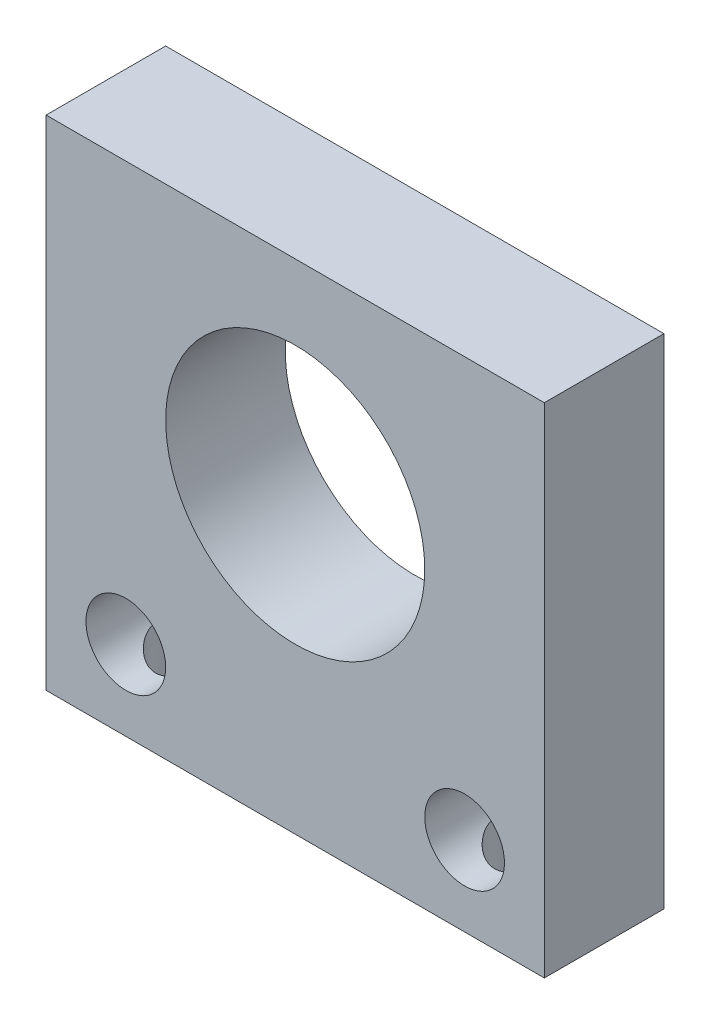
ISO-10303-21;
HEADER;
FILE_DESCRIPTION(('STEP AP214'),'2;1');
FILE_NAME('part.step','',(''),(''),'','','');
FILE_SCHEMA(('AUTOMOTIVE_DESIGN { 1 0 10303 214 1 1 1 1 }'));
ENDSEC;
DATA;
#1=APPLICATION_CONTEXT('core data for automotive mechanical design processes');
#2=APPLICATION_PROTOCOL_DEFINITION('international standard','automotive_design',2000,#1);
#3=PRODUCT_CONTEXT('',#1,'mechanical');
#4=PRODUCT('Part','Part','',(#3));
#5=PRODUCT_RELATED_PRODUCT_CATEGORY('part','',(#4));
#6=PRODUCT_DEFINITION_FORMATION('','',#4);
#7=PRODUCT_DEFINITION_CONTEXT('part definition',#1,'design');
#8=PRODUCT_DEFINITION('design','',#6,#7);
#9=PRODUCT_DEFINITION_SHAPE('','',#8);
#10=(LENGTH_UNIT() NAMED_UNIT(*) SI_UNIT(.MILLI.,.METRE.));
#11=(NAMED_UNIT(*) PLANE_ANGLE_UNIT() SI_UNIT($,.RADIAN.));
#12=(NAMED_UNIT(*) SI_UNIT($,.STERADIAN.) SOLID_ANGLE_UNIT());
#13=UNCERTAINTY_MEASURE_WITH_UNIT(LENGTH_MEASURE(1.E-05),#10,'distance_accuracy_value','');
#14=(GEOMETRIC_REPRESENTATION_CONTEXT(3) GLOBAL_UNCERTAINTY_ASSIGNED_CONTEXT((#13)) GLOBAL_UNIT_ASSIGNED_CONTEXT((#10,
#11,#12)) REPRESENTATION_CONTEXT('',''));
#15=CARTESIAN_POINT('',(0.,0.,0.));
#16=DIRECTION('',(0.,0.,1.));
#17=DIRECTION('',(1.,0.,0.));
#18=AXIS2_PLACEMENT_3D('',#15,#16,#17);
#19=CARTESIAN_POINT('',(25.,25.,12.));
#20=DIRECTION('',(-1.,0.,0.));
#21=DIRECTION('',(0.,-1.,0.));
#22=AXIS2_PLACEMENT_3D('',#19,#20,#21);
#23=PLANE('',#22);
#24=DIRECTION('',(0.,1.,0.));
#25=VECTOR('',#24,1.);
#26=CARTESIAN_POINT('',(25.,25.,0.));
#27=LINE('',#26,#25);
#28=CARTESIAN_POINT('',(25.,-25.,0.));
#29=VERTEX_POINT('',#28);
#30=CARTESIAN_POINT('',(25.,25.,0.));
#31=VERTEX_POINT('',#30);
#32=EDGE_CURVE('E95',#29,#31,#27,.T.);
#33=ORIENTED_EDGE('',*,*,#32,.T.);
#34=DIRECTION('',(0.,0.,-1.));
#35=VECTOR('',#34,1.);
#36=CARTESIAN_POINT('',(25.,25.,12.));
#37=LINE('',#36,#35);
#38=CARTESIAN_POINT('',(25.,25.,12.));
#39=VERTEX_POINT('',#38);
#40=EDGE_CURVE('E11',#39,#31,#37,.T.);
#41=ORIENTED_EDGE('',*,*,#40,.F.);
#42=DIRECTION('',(0.,1.,0.));
#43=VECTOR('',#42,1.);
#44=CARTESIAN_POINT('',(25.,25.,12.));
#45=LINE('',#44,#43);
#46=CARTESIAN_POINT('',(25.,-25.,12.));
#47=VERTEX_POINT('',#46);
#48=EDGE_CURVE('E83',#47,#39,#45,.T.);
#49=ORIENTED_EDGE('',*,*,#48,.F.);
#50=DIRECTION('',(0.,0.,-1.));
#51=VECTOR('',#50,1.);
#52=CARTESIAN_POINT('',(25.,-25.,12.));
#53=LINE('',#52,#51);
#54=EDGE_CURVE('E91',#47,#29,#53,.T.);
#55=ORIENTED_EDGE('',*,*,#54,.T.);
#56=EDGE_LOOP('',(#33,#41,#49,#55));
#57=FACE_BOUND('',#56,.T.);
#58=ADVANCED_FACE('F32',(#57),#23,.F.);
#59=CARTESIAN_POINT('',(-25.,25.,12.));
#60=DIRECTION('',(0.,-1.,0.));
#61=DIRECTION('',(0.,0.,-1.));
#62=AXIS2_PLACEMENT_3D('',#59,#60,#61);
#63=PLANE('',#62);
#64=DIRECTION('',(-1.,0.,0.));
#65=VECTOR('',#64,1.);
#66=CARTESIAN_POINT('',(-25.,25.,0.));
#67=LINE('',#66,#65);
#68=CARTESIAN_POINT('',(-25.,25.,0.));
#69=VERTEX_POINT('',#68);
#70=EDGE_CURVE('E87',#31,#69,#67,.T.);
#71=ORIENTED_EDGE('',*,*,#70,.T.);
#72=DIRECTION('',(0.,0.,-1.));
#73=VECTOR('',#72,1.);
#74=CARTESIAN_POINT('',(-25.,25.,12.));
#75=LINE('',#74,#73);
#76=CARTESIAN_POINT('',(-25.,25.,12.));
#77=VERTEX_POINT('',#76);
#78=EDGE_CURVE('E40',#77,#69,#75,.T.);
#79=ORIENTED_EDGE('',*,*,#78,.F.);
#80=DIRECTION('',(-1.,0.,0.));
#81=VECTOR('',#80,1.);
#82=CARTESIAN_POINT('',(-25.,25.,12.));
#83=LINE('',#82,#81);
#84=EDGE_CURVE('E78',#39,#77,#83,.T.);
#85=ORIENTED_EDGE('',*,*,#84,.F.);
#86=ORIENTED_EDGE('',*,*,#40,.T.);
#87=EDGE_LOOP('',(#71,#79,#85,#86));
#88=FACE_BOUND('',#87,.T.);
#89=ADVANCED_FACE('F86',(#88),#63,.F.);
#90=CARTESIAN_POINT('',(-25.,25.,12.));
#91=DIRECTION('',(1.,0.,0.));
#92=DIRECTION('',(0.,1.,0.));
#93=AXIS2_PLACEMENT_3D('',#90,#91,#92);
#94=PLANE('',#93);
#95=DIRECTION('',(0.,-1.,0.));
#96=VECTOR('',#95,1.);
#97=CARTESIAN_POINT('',(-25.,25.,0.));
#98=LINE('',#97,#96);
#99=CARTESIAN_POINT('',(-25.,-25.,0.));
#100=VERTEX_POINT('',#99);
#101=EDGE_CURVE('E65',#69,#100,#98,.T.);
#102=ORIENTED_EDGE('',*,*,#101,.T.);
#103=DIRECTION('',(0.,0.,-1.));
#104=VECTOR('',#103,1.);
#105=CARTESIAN_POINT('',(-25.,-25.,12.));
#106=LINE('',#105,#104);
#107=CARTESIAN_POINT('',(-25.,-25.,12.));
#108=VERTEX_POINT('',#107);
#109=EDGE_CURVE('E88',#108,#100,#106,.T.);
#110=ORIENTED_EDGE('',*,*,#109,.F.);
#111=DIRECTION('',(0.,-1.,0.));
#112=VECTOR('',#111,1.);
#113=CARTESIAN_POINT('',(-25.,25.,12.));
#114=LINE('',#113,#112);
#115=EDGE_CURVE('E81',#77,#108,#114,.T.);
#116=ORIENTED_EDGE('',*,*,#115,.F.);
#117=ORIENTED_EDGE('',*,*,#78,.T.);
#118=EDGE_LOOP('',(#102,#110,#116,#117));
#119=FACE_BOUND('',#118,.T.);
#120=ADVANCED_FACE('F89',(#119),#94,.F.);
#121=CARTESIAN_POINT('',(-25.,-25.,12.));
#122=DIRECTION('',(0.,1.,0.));
#123=DIRECTION('',(0.,0.,1.));
#124=AXIS2_PLACEMENT_3D('',#121,#122,#123);
#125=PLANE('',#124);
#126=CARTESIAN_POINT('',(-17.,-25.,6.));
#127=DIRECTION('',(0.,-1.,0.));
#128=DIRECTION('',(0.,0.,-1.));
#129=AXIS2_PLACEMENT_3D('',#126,#127,#128);
#130=CIRCLE('',#129,3.);
#131=CARTESIAN_POINT('',(-17.,-25.,3.));
#132=VERTEX_POINT('',#131);
#133=EDGE_CURVE('E136',#132,#132,#130,.T.);
#134=ORIENTED_EDGE('',*,*,#133,.F.);
#135=EDGE_LOOP('',(#134));
#136=FACE_BOUND('',#135,.T.);
#137=CARTESIAN_POINT('',(17.,-25.,6.));
#138=DIRECTION('',(0.,-1.,0.));
#139=DIRECTION('',(0.,0.,-1.));
#140=AXIS2_PLACEMENT_3D('',#137,#138,#139);
#141=CIRCLE('',#140,2.99999999999999);
#142=CARTESIAN_POINT('',(17.,-25.,3.00000000000001));
#143=VERTEX_POINT('',#142);
#144=EDGE_CURVE('E126',#143,#143,#141,.T.);
#145=ORIENTED_EDGE('',*,*,#144,.F.);
#146=EDGE_LOOP('',(#145));
#147=FACE_BOUND('',#146,.T.);
#148=DIRECTION('',(1.,0.,0.));
#149=VECTOR('',#148,1.);
#150=CARTESIAN_POINT('',(-25.,-25.,0.));
#151=LINE('',#150,#149);
#152=EDGE_CURVE('E71',#100,#29,#151,.T.);
#153=ORIENTED_EDGE('',*,*,#152,.T.);
#154=ORIENTED_EDGE('',*,*,#54,.F.);
#155=DIRECTION('',(1.,0.,0.));
#156=VECTOR('',#155,1.);
#157=CARTESIAN_POINT('',(-25.,-25.,12.));
#158=LINE('',#157,#156);
#159=EDGE_CURVE('E48',#108,#47,#158,.T.);
#160=ORIENTED_EDGE('',*,*,#159,.F.);
#161=ORIENTED_EDGE('',*,*,#109,.T.);
#162=EDGE_LOOP('',(#153,#154,#160,#161));
#163=FACE_BOUND('',#162,.T.);
#164=ADVANCED_FACE('F103',(#136,#147,#163),#125,.F.);
#165=CARTESIAN_POINT('',(25.,-25.,12.));
#166=DIRECTION('',(0.,0.,1.));
#167=DIRECTION('',(1.,0.,0.));
#168=AXIS2_PLACEMENT_3D('',#165,#166,#167);
#169=PLANE('',#168);
#170=CARTESIAN_POINT('',(17.,-17.,12.));
#171=DIRECTION('',(0.,0.,1.));
#172=DIRECTION('',(1.,0.,0.));
#173=AXIS2_PLACEMENT_3D('',#170,#171,#172);
#174=CIRCLE('',#173,4.);
#175=CARTESIAN_POINT('',(21.,-17.,12.));
#176=VERTEX_POINT('',#175);
#177=EDGE_CURVE('E123',#176,#176,#174,.T.);
#178=ORIENTED_EDGE('',*,*,#177,.F.);
#179=EDGE_LOOP('',(#178));
#180=FACE_BOUND('',#179,.T.);
#181=CARTESIAN_POINT('',(-17.,-17.,12.));
#182=DIRECTION('',(0.,0.,1.));
#183=DIRECTION('',(1.,0.,0.));
#184=AXIS2_PLACEMENT_3D('',#181,#182,#183);
#185=CIRCLE('',#184,4.);
#186=CARTESIAN_POINT('',(-13.,-17.,12.));
#187=VERTEX_POINT('',#186);
#188=EDGE_CURVE('E117',#187,#187,#185,.T.);
#189=ORIENTED_EDGE('',*,*,#188,.F.);
#190=EDGE_LOOP('',(#189));
#191=FACE_BOUND('',#190,.T.);
#192=CARTESIAN_POINT('',(0.,4.5,12.));
#193=DIRECTION('',(0.,0.,1.));
#194=DIRECTION('',(1.,0.,0.));
#195=AXIS2_PLACEMENT_3D('',#192,#193,#194);
#196=CIRCLE('',#195,13.);
#197=CARTESIAN_POINT('',(13.,4.5,12.));
#198=VERTEX_POINT('',#197);
#199=EDGE_CURVE('E111',#198,#198,#196,.T.);
#200=ORIENTED_EDGE('',*,*,#199,.F.);
#201=EDGE_LOOP('',(#200));
#202=FACE_BOUND('',#201,.T.);
#203=ORIENTED_EDGE('',*,*,#48,.T.);
#204=ORIENTED_EDGE('',*,*,#84,.T.);
#205=ORIENTED_EDGE('',*,*,#115,.T.);
#206=ORIENTED_EDGE('',*,*,#159,.T.);
#207=EDGE_LOOP('',(#203,#204,#205,#206));
#208=FACE_BOUND('',#207,.T.);
#209=ADVANCED_FACE('F79',(#180,#191,#202,#208),#169,.T.);
#210=CARTESIAN_POINT('',(25.,-25.,0.));
#211=DIRECTION('',(0.,0.,1.));
#212=DIRECTION('',(1.,0.,0.));
#213=AXIS2_PLACEMENT_3D('',#210,#211,#212);
#214=PLANE('',#213);
#215=CARTESIAN_POINT('',(17.,-17.,0.));
#216=DIRECTION('',(0.,0.,1.));
#217=DIRECTION('',(1.,0.,0.));
#218=AXIS2_PLACEMENT_3D('',#215,#216,#217);
#219=CIRCLE('',#218,4.);
#220=CARTESIAN_POINT('',(21.,-17.,0.));
#221=VERTEX_POINT('',#220);
#222=EDGE_CURVE('E120',#221,#221,#219,.F.);
#223=ORIENTED_EDGE('',*,*,#222,.F.);
#224=EDGE_LOOP('',(#223));
#225=FACE_BOUND('',#224,.T.);
#226=CARTESIAN_POINT('',(-17.,-17.,0.));
#227=DIRECTION('',(0.,0.,1.));
#228=DIRECTION('',(1.,0.,0.));
#229=AXIS2_PLACEMENT_3D('',#226,#227,#228);
#230=CIRCLE('',#229,4.);
#231=CARTESIAN_POINT('',(-13.,-17.,0.));
#232=VERTEX_POINT('',#231);
#233=EDGE_CURVE('E114',#232,#232,#230,.F.);
#234=ORIENTED_EDGE('',*,*,#233,.F.);
#235=EDGE_LOOP('',(#234));
#236=FACE_BOUND('',#235,.T.);
#237=CARTESIAN_POINT('',(0.,4.5,0.));
#238=DIRECTION('',(0.,0.,1.));
#239=DIRECTION('',(1.,0.,0.));
#240=AXIS2_PLACEMENT_3D('',#237,#238,#239);
#241=CIRCLE('',#240,13.);
#242=CARTESIAN_POINT('',(13.,4.5,0.));
#243=VERTEX_POINT('',#242);
#244=EDGE_CURVE('E98',#243,#243,#241,.F.);
#245=ORIENTED_EDGE('',*,*,#244,.F.);
#246=EDGE_LOOP('',(#245));
#247=FACE_BOUND('',#246,.T.);
#248=ORIENTED_EDGE('',*,*,#32,.F.);
#249=ORIENTED_EDGE('',*,*,#152,.F.);
#250=ORIENTED_EDGE('',*,*,#101,.F.);
#251=ORIENTED_EDGE('',*,*,#70,.F.);
#252=EDGE_LOOP('',(#248,#249,#250,#251));
#253=FACE_BOUND('',#252,.T.);
#254=ADVANCED_FACE('F106',(#225,#236,#247,#253),#214,.F.);
#255=CARTESIAN_POINT('',(0.,4.5,-0.000999999999999265));
#256=DIRECTION('',(0.,0.,1.));
#257=DIRECTION('',(1.,0.,0.));
#258=AXIS2_PLACEMENT_3D('',#255,#256,#257);
#259=CYLINDRICAL_SURFACE('',#258,13.);
#260=ORIENTED_EDGE('',*,*,#199,.T.);
#261=EDGE_LOOP('',(#260));
#262=FACE_BOUND('',#261,.T.);
#263=ORIENTED_EDGE('',*,*,#244,.T.);
#264=EDGE_LOOP('',(#263));
#265=FACE_BOUND('',#264,.T.);
#266=ADVANCED_FACE('F177',(#262,#265),#259,.F.);
#267=CARTESIAN_POINT('',(-17.,-17.,-0.000999999999999265));
#268=DIRECTION('',(0.,0.,1.));
#269=DIRECTION('',(1.,0.,0.));
#270=AXIS2_PLACEMENT_3D('',#267,#268,#269);
#271=CYLINDRICAL_SURFACE('',#270,4.);
#272=CARTESIAN_POINT('',(-17.,-21.,3.));
#273=CARTESIAN_POINT('',(-17.073261367768,-20.9999992990119,3.00000074201897));
#274=CARTESIAN_POINT('',(-17.1465423510536,-20.9979806034464,3.00269050698686));
#275=CARTESIAN_POINT('',(-17.2925085389935,-20.9899624569939,3.013394860135));
#276=CARTESIAN_POINT('',(-17.3651933607932,-20.9839606241637,3.0214126345048));
#277=CARTESIAN_POINT('',(-17.5817314069839,-20.9601274508711,3.05333590602824));
#278=CARTESIAN_POINT('',(-17.7238926603924,-20.9364688801344,3.08511095799108));
#279=CARTESIAN_POINT('',(-17.9985066390113,-20.8759149040789,3.16742520757524));
#280=CARTESIAN_POINT('',(-18.1310126346565,-20.8391000031407,3.21785034838289));
#281=CARTESIAN_POINT('',(-18.3848352699409,-20.7550101702153,3.33508536693153));
#282=CARTESIAN_POINT('',(-18.5061551685841,-20.7077382985354,3.40189045158351));
#283=CARTESIAN_POINT('',(-18.7469321319516,-20.6009935701353,3.55652372522062));
#284=CARTESIAN_POINT('',(-18.8651763103052,-20.5407962331428,3.64572585127334));
#285=CARTESIAN_POINT('',(-19.0860644994078,-20.4153302798122,3.83900049584301));
#286=CARTESIAN_POINT('',(-19.1886839109146,-20.3500539063521,3.94309597244776));
#287=CARTESIAN_POINT('',(-19.3399322802619,-20.2449223726166,4.12053534410459));
#288=CARTESIAN_POINT('',(-19.3937945830414,-20.2052891581058,4.18963011240945));
#289=CARTESIAN_POINT('',(-19.4954835854826,-20.1267688793375,4.33258913082427));
#290=CARTESIAN_POINT('',(-19.5433084651355,-20.0878820430606,4.40645480905105));
#291=CARTESIAN_POINT('',(-19.6326117861933,-20.0121056255303,4.55877179488022));
#292=CARTESIAN_POINT('',(-19.6740978469184,-19.9752136814322,4.6372174379625));
#293=CARTESIAN_POINT('',(-19.7504313267714,-19.9047933973139,4.79870704754895));
#294=CARTESIAN_POINT('',(-19.785279820775,-19.8712645131028,4.88175026671391));
#295=CARTESIAN_POINT('',(-19.8576009065895,-19.7995453278082,5.07896227542374));
#296=CARTESIAN_POINT('',(-19.8925103700841,-19.7631556192376,5.19476977393461));
#297=CARTESIAN_POINT('',(-19.9484165631614,-19.7034312888821,5.43279706313414));
#298=CARTESIAN_POINT('',(-19.969445144175,-19.6800667983994,5.55500147433672));
#299=CARTESIAN_POINT('',(-19.996255598243,-19.6500753549433,5.80436202447177));
#300=CARTESIAN_POINT('',(-20.0018988715729,-19.6436005765876,5.93155277328338));
#301=CARTESIAN_POINT('',(-19.9969644904294,-19.6491905924503,6.18523066222906));
#302=CARTESIAN_POINT('',(-19.9863810204854,-19.6612620334149,6.31171753379498));
#303=CARTESIAN_POINT('',(-19.9519547346266,-19.6993524750279,6.54638250405958));
#304=CARTESIAN_POINT('',(-19.9296497136706,-19.7237431438601,6.65507269013584));
#305=CARTESIAN_POINT('',(-19.8741134363738,-19.7822838542336,6.86687780944832));
#306=CARTESIAN_POINT('',(-19.8408716781774,-19.8164432719457,6.96998727261395));
#307=CARTESIAN_POINT('',(-19.7406612760479,-19.9148353872999,7.23251274568741));
#308=CARTESIAN_POINT('',(-19.6656029678939,-19.9845129831659,7.38680082588364));
#309=CARTESIAN_POINT('',(-19.4923604682809,-20.1306659625217,7.67839305515968));
#310=CARTESIAN_POINT('',(-19.3941200856505,-20.2071575776123,7.81565468051557));
#311=CARTESIAN_POINT('',(-19.1730320814964,-20.3610334463755,8.07550677875058));
#312=CARTESIAN_POINT('',(-19.0496275103998,-20.4383917346593,8.19764121323223));
#313=CARTESIAN_POINT('',(-18.7808450435398,-20.5849607595651,8.42052729409203));
#314=CARTESIAN_POINT('',(-18.6355101085255,-20.65418696517,8.52131984052875));
#315=CARTESIAN_POINT('',(-18.3558041609579,-20.765594521557,8.6799615984263));
#316=CARTESIAN_POINT('',(-18.2250797406269,-20.810415419168,8.74236918857447));
#317=CARTESIAN_POINT('',(-17.9527043461487,-20.8874580880713,8.84844976078491));
#318=CARTESIAN_POINT('',(-17.8110602811554,-20.9196877491006,8.89213447637317));
#319=CARTESIAN_POINT('',(-17.5193524659451,-20.9689117737123,8.95850672640209));
#320=CARTESIAN_POINT('',(-17.3692425664775,-20.9858118631461,8.98106436025722));
#321=CARTESIAN_POINT('',(-17.0664024759298,-21.0023176694794,9.00309919236444));
#322=CARTESIAN_POINT('',(-16.9136734175787,-21.0019306830649,9.00258612850555));
#323=CARTESIAN_POINT('',(-16.6263915776414,-20.9848509559687,8.97977826944533));
#324=CARTESIAN_POINT('',(-16.4915553886724,-20.9698017763078,8.9596789546577));
#325=CARTESIAN_POINT('',(-16.2277786150078,-20.9270263597225,8.90205241154316));
#326=CARTESIAN_POINT('',(-16.0988392912168,-20.8992974253459,8.86452147483979));
#327=CARTESIAN_POINT('',(-15.8451666091751,-20.8319967842818,8.77222504832848));
#328=CARTESIAN_POINT('',(-15.7207422941255,-20.7920416528168,8.71689805245005));
#329=CARTESIAN_POINT('',(-15.4829623066276,-20.7033390611367,8.59165467378648));
#330=CARTESIAN_POINT('',(-15.3696081686064,-20.6545903847149,8.52173627270121));
#331=CARTESIAN_POINT('',(-15.136979535,-20.5423857594511,8.356435318386));
#332=CARTESIAN_POINT('',(-15.0198776855908,-20.47783324856,8.25875020522044));
#333=CARTESIAN_POINT('',(-14.8025492667112,-20.3447676839449,8.04797519436536));
#334=CARTESIAN_POINT('',(-14.7023611956172,-20.2762460592597,7.93485118533679));
#335=CARTESIAN_POINT('',(-14.5567623903738,-20.1678364186478,7.74317016965753));
#336=CARTESIAN_POINT('',(-14.5055879215901,-20.1275785522415,7.6691421417943));
#337=CARTESIAN_POINT('',(-14.4097522381844,-20.0486852312407,7.51617327787244));
#338=CARTESIAN_POINT('',(-14.3650934165984,-20.0100503764292,7.43723065191454));
#339=CARTESIAN_POINT('',(-14.2415900715641,-19.8988473562949,7.19341713181211));
#340=CARTESIAN_POINT('',(-14.1727713344538,-19.8306293449371,7.02097812384012));
#341=CARTESIAN_POINT('',(-14.0876783816709,-19.7423730621723,6.72915376575461));
#342=CARTESIAN_POINT('',(-14.0613779330393,-19.7139150253515,6.61521315950869));
#343=CARTESIAN_POINT('',(-14.0221714288551,-19.6708423304846,6.3825904834344));
#344=CARTESIAN_POINT('',(-14.0092354754516,-19.6561967788127,6.2639196166269));
#345=CARTESIAN_POINT('',(-13.9976930134541,-19.6431516796451,6.02434080493913));
#346=CARTESIAN_POINT('',(-13.9991592496169,-19.6448346059719,5.90342458554553));
#347=CARTESIAN_POINT('',(-14.0164627676864,-19.6643291788691,5.66388585032168));
#348=CARTESIAN_POINT('',(-14.0323185945897,-19.6821616385503,5.54526649617948));
#349=CARTESIAN_POINT('',(-14.0821217076285,-19.7363463967713,5.28817442441489));
#350=CARTESIAN_POINT('',(-14.1192628409931,-19.7758918581173,5.15102076535943));
#351=CARTESIAN_POINT('',(-14.2106132693348,-19.8676615343469,4.88691513829302));
#352=CARTESIAN_POINT('',(-14.2648656788297,-19.9199176988772,4.75998996808799));
#353=CARTESIAN_POINT('',(-14.3683867754536,-20.0129344017458,4.5567275201652));
#354=CARTESIAN_POINT('',(-14.4135168318761,-20.0518907245486,4.47738514370472));
#355=CARTESIAN_POINT('',(-14.5103774221758,-20.1314053591909,4.32368527646728));
#356=CARTESIAN_POINT('',(-14.562107603781,-20.1719635854515,4.24932751996646));
#357=CARTESIAN_POINT('',(-14.6719957002683,-20.2534724847945,4.10564453928959));
#358=CARTESIAN_POINT('',(-14.7301590471855,-20.2944234624514,4.03632365123923));
#359=CARTESIAN_POINT('',(-14.8527441978248,-20.3756032435117,3.90297982513369));
#360=CARTESIAN_POINT('',(-14.9171663099554,-20.4158320112115,3.83895714844265));
#361=CARTESIAN_POINT('',(-15.052718097185,-20.4948965138371,3.71602666692274));
#362=CARTESIAN_POINT('',(-15.1239000908959,-20.5337175166899,3.65716691863947));
#363=CARTESIAN_POINT('',(-15.2723201291205,-20.6086050255633,3.54567024293731));
#364=CARTESIAN_POINT('',(-15.3495568956644,-20.644672109693,3.49303200820526));
#365=CARTESIAN_POINT('',(-15.5096968258951,-20.7130254144582,3.39465805794524));
#366=CARTESIAN_POINT('',(-15.5925898186047,-20.74531815238,3.34891040356802));
#367=CARTESIAN_POINT('',(-15.7636575645171,-20.8052164046783,3.26494328395666));
#368=CARTESIAN_POINT('',(-15.8518295610309,-20.8328243370667,3.22671993349348));
#369=CARTESIAN_POINT('',(-16.0702608597425,-20.8927029417692,3.14443730103296));
#370=CARTESIAN_POINT('',(-16.202876968798,-20.9221986286542,3.10447563718239));
#371=CARTESIAN_POINT('',(-16.4743325364694,-20.967682598769,3.04315512041072));
#372=CARTESIAN_POINT('',(-16.6131534618698,-20.9837086019408,3.02174431321158));
#373=CARTESIAN_POINT('',(-16.7940719994169,-20.994909382017,3.00679070137652));
#374=CARTESIAN_POINT('',(-16.8351838911798,-20.9968157643703,3.00424689717904));
#375=CARTESIAN_POINT('',(-16.9175284379407,-20.9993613726478,3.00085120146832));
#376=CARTESIAN_POINT('',(-16.9587611113093,-21.0000003945868,2.99999958231686));
#377=CARTESIAN_POINT('',(-17.,-21.,3.));
#378=B_SPLINE_CURVE_WITH_KNOTS('',3,(#272,#273,#274,#275,#276,#277,#278,#279,#280,#281,#282,
#283,#284,#285,#286,#287,#288,#289,#290,#291,#292,#293,#294,#295,#296,#297,#298,#299,#300,#301,
#302,#303,#304,#305,#306,#307,#308,#309,#310,#311,#312,#313,#314,#315,#316,#317,#318,#319,#320,
#321,#322,#323,#324,#325,#326,#327,#328,#329,#330,#331,#332,#333,#334,#335,#336,#337,#338,#339,
#340,#341,#342,#343,#344,#345,#346,#347,#348,#349,#350,#351,#352,#353,#354,#355,#356,#357,#358,
#359,#360,#361,#362,#363,#364,#365,#366,#367,#368,#369,#370,#371,#372,#373,#374,#375,#376,#377),
.UNSPECIFIED.,.T.,.F.,(4,2,2,2,2,2,2,2,2,2,2,2,2,2,2,2,2,2,2,2,2,2,2,2,2,2,2,2,2,2,2,2,2,2,2,2,
2,2,2,2,2,2,2,2,2,2,2,2,2,2,2,2,4),(0.,0.219733524191398,0.439598569068991,0.879847634771394,
1.31744766307167,1.75491979362349,2.2329036222735,2.71163236402815,2.99983518527188,
3.28812468015056,3.57606487508902,3.86395840178996,4.24151729125786,4.61820678456563,
4.99827867308497,5.37848680666403,5.71806472391401,6.05796967267263,6.61051355677803,
7.16441076781762,7.73224459942165,8.29898017053365,8.75205702078762,9.20484951352218,
9.6604080839978,10.1157743699921,10.5253506608997,10.9350141243761,11.3591357103334,
11.7833160002107,12.2783345622972,12.7744651003689,13.0698938265096,13.3654307846348,
13.9540907813181,14.3138420927746,14.6727868466003,15.033545541411,15.3947698355934,
15.8348522835191,16.2760525671149,16.5734564783342,16.8708445226935,17.1684856206864,
17.466141392762,17.7663250552984,18.0664455283282,18.3660398682404,18.6654791022959,
19.0884486476652,19.5102297424977,19.6338980344064,19.7575862294511),.UNSPECIFIED.);
#379=CARTESIAN_POINT('',(-17.,-21.,3.));
#380=VERTEX_POINT('',#379);
#381=EDGE_CURVE('E149',#380,#380,#378,.T.);
#382=ORIENTED_EDGE('',*,*,#381,.F.);
#383=EDGE_LOOP('',(#382));
#384=FACE_BOUND('',#383,.T.);
#385=ORIENTED_EDGE('',*,*,#188,.T.);
#386=EDGE_LOOP('',(#385));
#387=FACE_BOUND('',#386,.T.);
#388=ORIENTED_EDGE('',*,*,#233,.T.);
#389=EDGE_LOOP('',(#388));
#390=FACE_BOUND('',#389,.T.);
#391=ADVANCED_FACE('F170',(#384,#387,#390),#271,.F.);
#392=CARTESIAN_POINT('',(17.,-17.,-0.000999999999999265));
#393=DIRECTION('',(0.,0.,1.));
#394=DIRECTION('',(1.,0.,0.));
#395=AXIS2_PLACEMENT_3D('',#392,#393,#394);
#396=CYLINDRICAL_SURFACE('',#395,4.);
#397=CARTESIAN_POINT('',(17.,-21.,3.00000000000001));
#398=CARTESIAN_POINT('',(16.926738632232,-20.9999992990119,3.00000074201898));
#399=CARTESIAN_POINT('',(16.8534576489464,-20.9979806034464,3.00269050698687));
#400=CARTESIAN_POINT('',(16.7074914610065,-20.9899624569939,3.01339486013501));
#401=CARTESIAN_POINT('',(16.6348066392068,-20.9839606241637,3.02141263450481));
#402=CARTESIAN_POINT('',(16.4182685930161,-20.9601274508711,3.05333590602825));
#403=CARTESIAN_POINT('',(16.2761073396076,-20.9364688801344,3.08511095799109));
#404=CARTESIAN_POINT('',(16.0014933609887,-20.8759149040789,3.16742520757525));
#405=CARTESIAN_POINT('',(15.8689873653435,-20.8391000031407,3.2178503483829));
#406=CARTESIAN_POINT('',(15.6151647300591,-20.7550101702152,3.33508536693154));
#407=CARTESIAN_POINT('',(15.4938448314159,-20.7077382985354,3.40189045158352));
#408=CARTESIAN_POINT('',(15.2530678680484,-20.6009935701353,3.55652372522063));
#409=CARTESIAN_POINT('',(15.1348236896948,-20.5407962331428,3.64572585127335));
#410=CARTESIAN_POINT('',(14.9139355005922,-20.4153302798122,3.83900049584302));
#411=CARTESIAN_POINT('',(14.8113160890854,-20.3500539063521,3.94309597244776));
#412=CARTESIAN_POINT('',(14.6600677197381,-20.2449223726166,4.12053534410459));
#413=CARTESIAN_POINT('',(14.6062054169586,-20.2052891581058,4.18963011240946));
#414=CARTESIAN_POINT('',(14.5045164145175,-20.1267688793375,4.33258913082428));
#415=CARTESIAN_POINT('',(14.4566915348645,-20.0878820430606,4.40645480905105));
#416=CARTESIAN_POINT('',(14.3673882138067,-20.0121056255303,4.55877179488023));
#417=CARTESIAN_POINT('',(14.3259021530816,-19.9752136814322,4.63721743796251));
#418=CARTESIAN_POINT('',(14.2495686732286,-19.9047933973139,4.79870704754896));
#419=CARTESIAN_POINT('',(14.214720179225,-19.8712645131028,4.88175026671392));
#420=CARTESIAN_POINT('',(14.1423990934105,-19.7995453278082,5.07896227542375));
#421=CARTESIAN_POINT('',(14.1074896299159,-19.7631556192376,5.19476977393461));
#422=CARTESIAN_POINT('',(14.0515834368386,-19.7034312888821,5.43279706313415));
#423=CARTESIAN_POINT('',(14.030554855825,-19.6800667983994,5.55500147433672));
#424=CARTESIAN_POINT('',(14.003744401757,-19.6500753549433,5.80436202447177));
#425=CARTESIAN_POINT('',(13.9981011284271,-19.6436005765876,5.93155277328338));
#426=CARTESIAN_POINT('',(14.0030355095706,-19.6491905924503,6.18523066222906));
#427=CARTESIAN_POINT('',(14.0136189795146,-19.6612620334149,6.31171753379498));
#428=CARTESIAN_POINT('',(14.0480452653734,-19.6993524750279,6.54638250405958));
#429=CARTESIAN_POINT('',(14.0703502863294,-19.7237431438601,6.65507269013584));
#430=CARTESIAN_POINT('',(14.1258865636262,-19.7822838542336,6.86687780944832));
#431=CARTESIAN_POINT('',(14.1591283218226,-19.8164432719457,6.96998727261396));
#432=CARTESIAN_POINT('',(14.2593387239521,-19.9148353872999,7.23251274568741));
#433=CARTESIAN_POINT('',(14.3343970321061,-19.9845129831659,7.38680082588364));
#434=CARTESIAN_POINT('',(14.5076395317191,-20.1306659625217,7.67839305515968));
#435=CARTESIAN_POINT('',(14.6058799143495,-20.2071575776123,7.81565468051557));
#436=CARTESIAN_POINT('',(14.8269679185037,-20.3610334463755,8.07550677875058));
#437=CARTESIAN_POINT('',(14.9503724896002,-20.4383917346593,8.19764121323223));
#438=CARTESIAN_POINT('',(15.2191549564602,-20.5849607595651,8.42052729409203));
#439=CARTESIAN_POINT('',(15.3644898914746,-20.65418696517,8.52131984052875));
#440=CARTESIAN_POINT('',(15.6441958390421,-20.765594521557,8.6799615984263));
#441=CARTESIAN_POINT('',(15.7749202593731,-20.810415419168,8.74236918857447));
#442=CARTESIAN_POINT('',(16.0472956538513,-20.8874580880713,8.84844976078491));
#443=CARTESIAN_POINT('',(16.1889397188446,-20.9196877491006,8.89213447637317));
#444=CARTESIAN_POINT('',(16.4806475340549,-20.9689117737123,8.95850672640209));
#445=CARTESIAN_POINT('',(16.6307574335225,-20.9858118631461,8.98106436025722));
#446=CARTESIAN_POINT('',(16.9335975240702,-21.0023176694794,9.00309919236444));
#447=CARTESIAN_POINT('',(17.0863265824213,-21.0019306830649,9.00258612850555));
#448=CARTESIAN_POINT('',(17.3736084223586,-20.9848509559687,8.97977826944533));
#449=CARTESIAN_POINT('',(17.5084446113276,-20.9698017763078,8.9596789546577));
#450=CARTESIAN_POINT('',(17.7722213849922,-20.9270263597225,8.90205241154316));
#451=CARTESIAN_POINT('',(17.9011607087832,-20.8992974253459,8.86452147483979));
#452=CARTESIAN_POINT('',(18.1548333908249,-20.8319967842818,8.77222504832848));
#453=CARTESIAN_POINT('',(18.2792577058745,-20.7920416528168,8.71689805245005));
#454=CARTESIAN_POINT('',(18.5170376933724,-20.7033390611367,8.59165467378648));
#455=CARTESIAN_POINT('',(18.6303918313936,-20.6545903847149,8.52173627270121));
#456=CARTESIAN_POINT('',(18.863020465,-20.5423857594511,8.356435318386));
#457=CARTESIAN_POINT('',(18.9801223144092,-20.47783324856,8.25875020522044));
#458=CARTESIAN_POINT('',(19.1974507332888,-20.3447676839449,8.04797519436536));
#459=CARTESIAN_POINT('',(19.2976388043828,-20.2762460592597,7.93485118533679));
#460=CARTESIAN_POINT('',(19.4432376096262,-20.1678364186478,7.74317016965753));
#461=CARTESIAN_POINT('',(19.4944120784099,-20.1275785522415,7.6691421417943));
#462=CARTESIAN_POINT('',(19.5902477618156,-20.0486852312407,7.51617327787244));
#463=CARTESIAN_POINT('',(19.6349065834016,-20.0100503764292,7.43723065191453));
#464=CARTESIAN_POINT('',(19.7584099284359,-19.8988473562949,7.19341713181211));
#465=CARTESIAN_POINT('',(19.8272286655462,-19.8306293449371,7.02097812384012));
#466=CARTESIAN_POINT('',(19.9123216183291,-19.7423730621723,6.72915376575461));
#467=CARTESIAN_POINT('',(19.9386220669607,-19.7139150253515,6.61521315950869));
#468=CARTESIAN_POINT('',(19.9778285711449,-19.6708423304846,6.3825904834344));
#469=CARTESIAN_POINT('',(19.9907645245484,-19.6561967788127,6.2639196166269));
#470=CARTESIAN_POINT('',(20.0023069865459,-19.6431516796451,6.02434080493913));
#471=CARTESIAN_POINT('',(20.0008407503831,-19.6448346059719,5.90342458554553));
#472=CARTESIAN_POINT('',(19.9835372323136,-19.6643291788691,5.66388585032168));
#473=CARTESIAN_POINT('',(19.9676814054103,-19.6821616385503,5.54526649617948));
#474=CARTESIAN_POINT('',(19.9178782923715,-19.7363463967713,5.28817442441489));
#475=CARTESIAN_POINT('',(19.8807371590069,-19.7758918581173,5.15102076535943));
#476=CARTESIAN_POINT('',(19.7893867306652,-19.8676615343469,4.88691513829302));
#477=CARTESIAN_POINT('',(19.7351343211703,-19.9199176988773,4.75998996808799));
#478=CARTESIAN_POINT('',(19.6316132245464,-20.0129344017458,4.5567275201652));
#479=CARTESIAN_POINT('',(19.5864831681239,-20.0518907245487,4.47738514370471));
#480=CARTESIAN_POINT('',(19.4896225778242,-20.1314053591909,4.32368527646727));
#481=CARTESIAN_POINT('',(19.437892396219,-20.1719635854515,4.24932751996645));
#482=CARTESIAN_POINT('',(19.3280042997317,-20.2534724847946,4.10564453928958));
#483=CARTESIAN_POINT('',(19.2698409528145,-20.2944234624514,4.03632365123922));
#484=CARTESIAN_POINT('',(19.1472558021751,-20.3756032435117,3.90297982513369));
#485=CARTESIAN_POINT('',(19.0828336900446,-20.4158320112116,3.83895714844265));
#486=CARTESIAN_POINT('',(18.9472819028149,-20.4948965138371,3.71602666692274));
#487=CARTESIAN_POINT('',(18.8760999091041,-20.53371751669,3.65716691863947));
#488=CARTESIAN_POINT('',(18.7276798708795,-20.6086050255633,3.54567024293731));
#489=CARTESIAN_POINT('',(18.6504431043356,-20.644672109693,3.49303200820526));
#490=CARTESIAN_POINT('',(18.4903031741049,-20.7130254144583,3.39465805794524));
#491=CARTESIAN_POINT('',(18.4074101813953,-20.74531815238,3.34891040356802));
#492=CARTESIAN_POINT('',(18.2363424354829,-20.8052164046783,3.26494328395666));
#493=CARTESIAN_POINT('',(18.148170438969,-20.8328243370667,3.22671993349348));
#494=CARTESIAN_POINT('',(17.9297391402575,-20.8927029417692,3.14443730103296));
#495=CARTESIAN_POINT('',(17.797123031202,-20.9221986286542,3.1044756371824));
#496=CARTESIAN_POINT('',(17.5256674635306,-20.967682598769,3.04315512041073));
#497=CARTESIAN_POINT('',(17.3868465381302,-20.9837086019408,3.02174431321159));
#498=CARTESIAN_POINT('',(17.2059280005831,-20.994909382017,3.00679070137653));
#499=CARTESIAN_POINT('',(17.1648161088202,-20.9968157643703,3.00424689717905));
#500=CARTESIAN_POINT('',(17.0824715620593,-20.9993613726478,3.00085120146833));
#501=CARTESIAN_POINT('',(17.0412388886907,-21.0000003945868,2.99999958231687));
#502=CARTESIAN_POINT('',(17.,-21.,3.00000000000001));
#503=B_SPLINE_CURVE_WITH_KNOTS('',3,(#397,#398,#399,#400,#401,#402,#403,#404,#405,#406,#407,
#408,#409,#410,#411,#412,#413,#414,#415,#416,#417,#418,#419,#420,#421,#422,#423,#424,#425,#426,
#427,#428,#429,#430,#431,#432,#433,#434,#435,#436,#437,#438,#439,#440,#441,#442,#443,#444,#445,
#446,#447,#448,#449,#450,#451,#452,#453,#454,#455,#456,#457,#458,#459,#460,#461,#462,#463,#464,
#465,#466,#467,#468,#469,#470,#471,#472,#473,#474,#475,#476,#477,#478,#479,#480,#481,#482,#483,
#484,#485,#486,#487,#488,#489,#490,#491,#492,#493,#494,#495,#496,#497,#498,#499,#500,#501,#502),
.UNSPECIFIED.,.T.,.F.,(4,2,2,2,2,2,2,2,2,2,2,2,2,2,2,2,2,2,2,2,2,2,2,2,2,2,2,2,2,2,2,2,2,2,2,2,
2,2,2,2,2,2,2,2,2,2,2,2,2,2,2,2,4),(0.,0.219733524191395,0.439598569068991,0.879847634771394,
1.31744766307167,1.75491979362349,2.2329036222735,2.71163236402815,2.99983518527188,
3.28812468015056,3.57606487508901,3.86395840178996,4.24151729125786,4.61820678456563,
4.99827867308496,5.37848680666402,5.718064723914,6.05796967267262,6.61051355677802,
7.16441076781761,7.73224459942163,8.29898017053364,8.7520570207876,9.20484951352216,
9.66040808399779,10.1157743699921,10.5253506608997,10.9350141243761,11.3591357103334,
11.7833160002106,12.2783345622972,12.7744651003688,13.0698938265096,13.3654307846348,
13.9540907813181,14.3138420927746,14.6727868466002,15.033545541411,15.3947698355934,
15.8348522835191,16.2760525671149,16.5734564783342,16.8708445226935,17.1684856206864,
17.466141392762,17.7663250552984,18.0664455283281,18.3660398682404,18.6654791022958,
19.0884486476651,19.5102297424976,19.6338980344063,19.757586229451),.UNSPECIFIED.);
#504=CARTESIAN_POINT('',(17.,-21.,3.00000000000001));
#505=VERTEX_POINT('',#504);
#506=EDGE_CURVE('E129',#505,#505,#503,.T.);
#507=ORIENTED_EDGE('',*,*,#506,.F.);
#508=EDGE_LOOP('',(#507));
#509=FACE_BOUND('',#508,.T.);
#510=ORIENTED_EDGE('',*,*,#177,.T.);
#511=EDGE_LOOP('',(#510));
#512=FACE_BOUND('',#511,.T.);
#513=ORIENTED_EDGE('',*,*,#222,.T.);
#514=EDGE_LOOP('',(#513));
#515=FACE_BOUND('',#514,.T.);
#516=ADVANCED_FACE('F165',(#509,#512,#515),#396,.F.);
#517=CARTESIAN_POINT('',(17.,25.001,6.));
#518=DIRECTION('',(0.,-1.,0.));
#519=DIRECTION('',(0.,0.,-1.));
#520=AXIS2_PLACEMENT_3D('',#517,#518,#519);
#521=CYLINDRICAL_SURFACE('',#520,2.99999999999999);
#522=ORIENTED_EDGE('',*,*,#144,.T.);
#523=EDGE_LOOP('',(#522));
#524=FACE_BOUND('',#523,.T.);
#525=ORIENTED_EDGE('',*,*,#506,.T.);
#526=EDGE_LOOP('',(#525));
#527=FACE_BOUND('',#526,.T.);
#528=ADVANCED_FACE('F138',(#524,#527),#521,.F.);
#529=CARTESIAN_POINT('',(-17.,25.001,6.));
#530=DIRECTION('',(0.,-1.,0.));
#531=DIRECTION('',(0.,0.,-1.));
#532=AXIS2_PLACEMENT_3D('',#529,#530,#531);
#533=CYLINDRICAL_SURFACE('',#532,3.);
#534=ORIENTED_EDGE('',*,*,#133,.T.);
#535=EDGE_LOOP('',(#534));
#536=FACE_BOUND('',#535,.T.);
#537=ORIENTED_EDGE('',*,*,#381,.T.);
#538=EDGE_LOOP('',(#537));
#539=FACE_BOUND('',#538,.T.);
#540=ADVANCED_FACE('F143',(#536,#539),#533,.F.);
#541=CLOSED_SHELL('',(#58,#89,#120,#164,#209,#254,#266,#391,#516,#528,#540));
#542=MANIFOLD_SOLID_BREP('B2',#541);
#543=ADVANCED_BREP_SHAPE_REPRESENTATION('',(#18,#542),#14);
#544=SHAPE_DEFINITION_REPRESENTATION(#9,#543);
ENDSEC;
END-ISO-10303-21;
